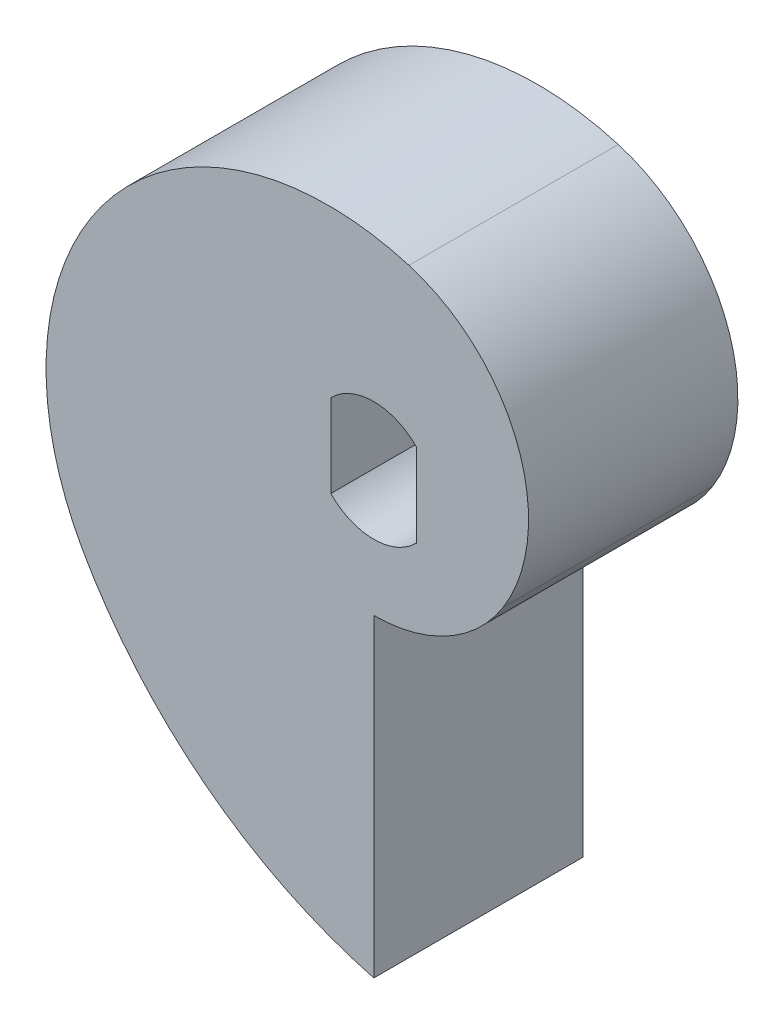
ISO-10303-21;
HEADER;
FILE_DESCRIPTION(('STEP AP214'),'2;1');
FILE_NAME('part.step','',(''),(''),'','','');
FILE_SCHEMA(('AUTOMOTIVE_DESIGN { 1 0 10303 214 1 1 1 1 }'));
ENDSEC;
DATA;
#1=APPLICATION_CONTEXT('core data for automotive mechanical design processes');
#2=APPLICATION_PROTOCOL_DEFINITION('international standard','automotive_design',2000,#1);
#3=PRODUCT_CONTEXT('',#1,'mechanical');
#4=PRODUCT('Part','Part','',(#3));
#5=PRODUCT_RELATED_PRODUCT_CATEGORY('part','',(#4));
#6=PRODUCT_DEFINITION_FORMATION('','',#4);
#7=PRODUCT_DEFINITION_CONTEXT('part definition',#1,'design');
#8=PRODUCT_DEFINITION('design','',#6,#7);
#9=PRODUCT_DEFINITION_SHAPE('','',#8);
#10=(LENGTH_UNIT() NAMED_UNIT(*) SI_UNIT(.MILLI.,.METRE.));
#11=(NAMED_UNIT(*) PLANE_ANGLE_UNIT() SI_UNIT($,.RADIAN.));
#12=(NAMED_UNIT(*) SI_UNIT($,.STERADIAN.) SOLID_ANGLE_UNIT());
#13=UNCERTAINTY_MEASURE_WITH_UNIT(LENGTH_MEASURE(1.E-05),#10,'distance_accuracy_value','');
#14=(GEOMETRIC_REPRESENTATION_CONTEXT(3) GLOBAL_UNCERTAINTY_ASSIGNED_CONTEXT((#13)) GLOBAL_UNIT_ASSIGNED_CONTEXT((#10,
#11,#12)) REPRESENTATION_CONTEXT('',''));
#15=CARTESIAN_POINT('',(0.,0.,0.));
#16=DIRECTION('',(0.,0.,1.));
#17=DIRECTION('',(1.,0.,0.));
#18=AXIS2_PLACEMENT_3D('',#15,#16,#17);
#19=CARTESIAN_POINT('',(-0.598579802256043,1.66233607974994,10.));
#20=DIRECTION('',(0.,0.,-1.));
#21=DIRECTION('',(-1.,0.,0.));
#22=AXIS2_PLACEMENT_3D('',#19,#20,#21);
#23=PLANE('',#22);
#24=CARTESIAN_POINT('',(-0.598579802256043,1.66233607974994,10.));
#25=DIRECTION('',(0.,0.,1.));
#26=DIRECTION('',(-1.,0.,0.));
#27=AXIS2_PLACEMENT_3D('',#24,#25,#26);
#28=CIRCLE('',#27,7.99421046117534);
#29=CARTESIAN_POINT('',(6.18171982166274,-2.57263002489034,10.));
#30=VERTEX_POINT('',#29);
#31=CARTESIAN_POINT('',(1.68133129306247,9.32454243921384,10.));
#32=VERTEX_POINT('',#31);
#33=EDGE_CURVE('E142',#30,#32,#28,.T.);
#34=ORIENTED_EDGE('',*,*,#33,.T.);
#35=CARTESIAN_POINT('',(-2.16584701226822,-3.60485385945115,10.));
#36=DIRECTION('',(0.,0.,1.));
#37=DIRECTION('',(-1.,0.,0.));
#38=AXIS2_PLACEMENT_3D('',#35,#36,#37);
#39=CIRCLE('',#38,13.4896282217465);
#40=CARTESIAN_POINT('',(-13.9291618711325,-10.2074664553985,10.));
#41=VERTEX_POINT('',#40);
#42=EDGE_CURVE('E145',#32,#41,#39,.T.);
#43=ORIENTED_EDGE('',*,*,#42,.T.);
#44=CARTESIAN_POINT('',(5.79406700412999,0.862953827233727,10.));
#45=DIRECTION('',(0.,0.,1.));
#46=DIRECTION('',(-1.,0.,0.));
#47=AXIS2_PLACEMENT_3D('',#44,#45,#46);
#48=CIRCLE('',#47,22.6176913609701);
#49=CARTESIAN_POINT('',(0.,-21.,10.));
#50=VERTEX_POINT('',#49);
#51=EDGE_CURVE('E148',#41,#50,#48,.T.);
#52=ORIENTED_EDGE('',*,*,#51,.T.);
#53=DIRECTION('',(0.,1.,0.));
#54=VECTOR('',#53,1.);
#55=CARTESIAN_POINT('',(0.,-6.,10.));
#56=LINE('',#55,#54);
#57=CARTESIAN_POINT('',(0.,-6.,10.));
#58=VERTEX_POINT('',#57);
#59=EDGE_CURVE('E150',#50,#58,#56,.T.);
#60=ORIENTED_EDGE('',*,*,#59,.T.);
#61=CARTESIAN_POINT('',(0.,1.28846393337251,10.));
#62=DIRECTION('',(0.,0.,1.));
#63=DIRECTION('',(-1.,0.,0.));
#64=AXIS2_PLACEMENT_3D('',#61,#62,#63);
#65=CIRCLE('',#64,7.28846393337251);
#66=EDGE_CURVE('E152',#58,#30,#65,.T.);
#67=ORIENTED_EDGE('',*,*,#66,.T.);
#68=EDGE_LOOP('',(#34,#43,#52,#60,#67));
#69=FACE_BOUND('',#68,.T.);
#70=CARTESIAN_POINT('',(0.,0.,10.));
#71=DIRECTION('',(0.,0.,1.));
#72=DIRECTION('',(1.,0.,0.));
#73=AXIS2_PLACEMENT_3D('',#70,#71,#72);
#74=CIRCLE('',#73,2.85);
#75=CARTESIAN_POINT('',(2.05,1.97989898732233,10.));
#76=VERTEX_POINT('',#75);
#77=CARTESIAN_POINT('',(-2.05,1.97989898732233,10.));
#78=VERTEX_POINT('',#77);
#79=EDGE_CURVE('E106',#76,#78,#74,.T.);
#80=ORIENTED_EDGE('',*,*,#79,.F.);
#81=DIRECTION('',(0.,1.,0.));
#82=VECTOR('',#81,1.);
#83=CARTESIAN_POINT('',(2.05,1.97989898732233,10.));
#84=LINE('',#83,#82);
#85=CARTESIAN_POINT('',(2.05,-1.97989898732233,10.));
#86=VERTEX_POINT('',#85);
#87=EDGE_CURVE('E128',#86,#76,#84,.T.);
#88=ORIENTED_EDGE('',*,*,#87,.F.);
#89=CARTESIAN_POINT('',(0.,0.,10.));
#90=DIRECTION('',(0.,0.,1.));
#91=DIRECTION('',(1.,0.,0.));
#92=AXIS2_PLACEMENT_3D('',#89,#90,#91);
#93=CIRCLE('',#92,2.85);
#94=CARTESIAN_POINT('',(-2.05,-1.97989898732233,10.));
#95=VERTEX_POINT('',#94);
#96=EDGE_CURVE('E126',#95,#86,#93,.T.);
#97=ORIENTED_EDGE('',*,*,#96,.F.);
#98=DIRECTION('',(0.,-1.,0.));
#99=VECTOR('',#98,1.);
#100=CARTESIAN_POINT('',(-2.05,1.97989898732233,10.));
#101=LINE('',#100,#99);
#102=EDGE_CURVE('E114',#78,#95,#101,.T.);
#103=ORIENTED_EDGE('',*,*,#102,.F.);
#104=EDGE_LOOP('',(#80,#88,#97,#103));
#105=FACE_BOUND('',#104,.T.);
#106=ADVANCED_FACE('F35',(#69,#105),#23,.F.);
#107=CARTESIAN_POINT('',(-0.598579802256043,1.66233607974994,0.));
#108=DIRECTION('',(0.,0.,-1.));
#109=DIRECTION('',(-1.,0.,0.));
#110=AXIS2_PLACEMENT_3D('',#107,#108,#109);
#111=PLANE('',#110);
#112=CARTESIAN_POINT('',(-0.598579802256043,1.66233607974994,0.));
#113=DIRECTION('',(0.,0.,1.));
#114=DIRECTION('',(-1.,0.,0.));
#115=AXIS2_PLACEMENT_3D('',#112,#113,#114);
#116=CIRCLE('',#115,7.99421046117534);
#117=CARTESIAN_POINT('',(6.18171982166274,-2.57263002489034,0.));
#118=VERTEX_POINT('',#117);
#119=CARTESIAN_POINT('',(1.68133129306247,9.32454243921384,0.));
#120=VERTEX_POINT('',#119);
#121=EDGE_CURVE('E122',#118,#120,#116,.T.);
#122=ORIENTED_EDGE('',*,*,#121,.F.);
#123=CARTESIAN_POINT('',(0.,1.28846393337251,0.));
#124=DIRECTION('',(0.,0.,1.));
#125=DIRECTION('',(-1.,0.,0.));
#126=AXIS2_PLACEMENT_3D('',#123,#124,#125);
#127=CIRCLE('',#126,7.28846393337251);
#128=CARTESIAN_POINT('',(0.,-6.,0.));
#129=VERTEX_POINT('',#128);
#130=EDGE_CURVE('E146',#129,#118,#127,.T.);
#131=ORIENTED_EDGE('',*,*,#130,.F.);
#132=DIRECTION('',(0.,1.,0.));
#133=VECTOR('',#132,1.);
#134=CARTESIAN_POINT('',(0.,-6.,0.));
#135=LINE('',#134,#133);
#136=CARTESIAN_POINT('',(0.,-21.,0.));
#137=VERTEX_POINT('',#136);
#138=EDGE_CURVE('E161',#137,#129,#135,.T.);
#139=ORIENTED_EDGE('',*,*,#138,.F.);
#140=CARTESIAN_POINT('',(5.79406700412999,0.862953827233727,0.));
#141=DIRECTION('',(0.,0.,1.));
#142=DIRECTION('',(-1.,0.,0.));
#143=AXIS2_PLACEMENT_3D('',#140,#141,#142);
#144=CIRCLE('',#143,22.6176913609701);
#145=CARTESIAN_POINT('',(-13.9291618711325,-10.2074664553985,0.));
#146=VERTEX_POINT('',#145);
#147=EDGE_CURVE('E159',#146,#137,#144,.T.);
#148=ORIENTED_EDGE('',*,*,#147,.F.);
#149=CARTESIAN_POINT('',(-2.16584701226822,-3.60485385945115,0.));
#150=DIRECTION('',(0.,0.,1.));
#151=DIRECTION('',(-1.,0.,0.));
#152=AXIS2_PLACEMENT_3D('',#149,#150,#151);
#153=CIRCLE('',#152,13.4896282217465);
#154=EDGE_CURVE('E157',#120,#146,#153,.T.);
#155=ORIENTED_EDGE('',*,*,#154,.F.);
#156=EDGE_LOOP('',(#122,#131,#139,#148,#155));
#157=FACE_BOUND('',#156,.T.);
#158=DIRECTION('',(0.,1.,0.));
#159=VECTOR('',#158,1.);
#160=CARTESIAN_POINT('',(2.05,1.97989898732233,0.));
#161=LINE('',#160,#159);
#162=CARTESIAN_POINT('',(2.05,-1.97989898732233,0.));
#163=VERTEX_POINT('',#162);
#164=CARTESIAN_POINT('',(2.05,1.97989898732233,0.));
#165=VERTEX_POINT('',#164);
#166=EDGE_CURVE('E115',#163,#165,#161,.T.);
#167=ORIENTED_EDGE('',*,*,#166,.T.);
#168=CARTESIAN_POINT('',(0.,0.,0.));
#169=DIRECTION('',(0.,0.,1.));
#170=DIRECTION('',(1.,0.,0.));
#171=AXIS2_PLACEMENT_3D('',#168,#169,#170);
#172=CIRCLE('',#171,2.85);
#173=CARTESIAN_POINT('',(-2.05,1.97989898732233,0.));
#174=VERTEX_POINT('',#173);
#175=EDGE_CURVE('E58',#165,#174,#172,.T.);
#176=ORIENTED_EDGE('',*,*,#175,.T.);
#177=DIRECTION('',(0.,-1.,0.));
#178=VECTOR('',#177,1.);
#179=CARTESIAN_POINT('',(-2.05,1.97989898732233,0.));
#180=LINE('',#179,#178);
#181=CARTESIAN_POINT('',(-2.05,-1.97989898732233,0.));
#182=VERTEX_POINT('',#181);
#183=EDGE_CURVE('E121',#174,#182,#180,.T.);
#184=ORIENTED_EDGE('',*,*,#183,.T.);
#185=CARTESIAN_POINT('',(0.,0.,0.));
#186=DIRECTION('',(0.,0.,1.));
#187=DIRECTION('',(1.,0.,0.));
#188=AXIS2_PLACEMENT_3D('',#185,#186,#187);
#189=CIRCLE('',#188,2.85);
#190=EDGE_CURVE('E134',#182,#163,#189,.T.);
#191=ORIENTED_EDGE('',*,*,#190,.T.);
#192=EDGE_LOOP('',(#167,#176,#184,#191));
#193=FACE_BOUND('',#192,.T.);
#194=ADVANCED_FACE('F182',(#157,#193),#111,.T.);
#195=CARTESIAN_POINT('',(-0.598579802256043,1.66233607974994,10.));
#196=DIRECTION('',(0.,0.,-1.));
#197=DIRECTION('',(-1.,0.,0.));
#198=AXIS2_PLACEMENT_3D('',#195,#196,#197);
#199=CYLINDRICAL_SURFACE('',#198,7.99421046117534);
#200=ORIENTED_EDGE('',*,*,#121,.T.);
#201=DIRECTION('',(0.,0.,-1.));
#202=VECTOR('',#201,1.);
#203=CARTESIAN_POINT('',(1.68133129306247,9.32454243921384,10.));
#204=LINE('',#203,#202);
#205=EDGE_CURVE('E11',#32,#120,#204,.T.);
#206=ORIENTED_EDGE('',*,*,#205,.F.);
#207=ORIENTED_EDGE('',*,*,#33,.F.);
#208=DIRECTION('',(0.,0.,-1.));
#209=VECTOR('',#208,1.);
#210=CARTESIAN_POINT('',(6.18171982166274,-2.57263002489034,10.));
#211=LINE('',#210,#209);
#212=EDGE_CURVE('E154',#30,#118,#211,.T.);
#213=ORIENTED_EDGE('',*,*,#212,.T.);
#214=EDGE_LOOP('',(#200,#206,#207,#213));
#215=FACE_BOUND('',#214,.T.);
#216=ADVANCED_FACE('F37',(#215),#199,.T.);
#217=CARTESIAN_POINT('',(-2.16584701226822,-3.60485385945115,10.));
#218=DIRECTION('',(0.,0.,-1.));
#219=DIRECTION('',(-1.,0.,0.));
#220=AXIS2_PLACEMENT_3D('',#217,#218,#219);
#221=CYLINDRICAL_SURFACE('',#220,13.4896282217465);
#222=ORIENTED_EDGE('',*,*,#154,.T.);
#223=DIRECTION('',(0.,0.,-1.));
#224=VECTOR('',#223,1.);
#225=CARTESIAN_POINT('',(-13.9291618711325,-10.2074664553985,10.));
#226=LINE('',#225,#224);
#227=EDGE_CURVE('E43',#41,#146,#226,.T.);
#228=ORIENTED_EDGE('',*,*,#227,.F.);
#229=ORIENTED_EDGE('',*,*,#42,.F.);
#230=ORIENTED_EDGE('',*,*,#205,.T.);
#231=EDGE_LOOP('',(#222,#228,#229,#230));
#232=FACE_BOUND('',#231,.T.);
#233=ADVANCED_FACE('F196',(#232),#221,.T.);
#234=CARTESIAN_POINT('',(5.79406700412999,0.862953827233727,10.));
#235=DIRECTION('',(0.,0.,-1.));
#236=DIRECTION('',(-1.,0.,0.));
#237=AXIS2_PLACEMENT_3D('',#234,#235,#236);
#238=CYLINDRICAL_SURFACE('',#237,22.6176913609701);
#239=ORIENTED_EDGE('',*,*,#147,.T.);
#240=DIRECTION('',(0.,0.,-1.));
#241=VECTOR('',#240,1.);
#242=CARTESIAN_POINT('',(0.,-21.,10.));
#243=LINE('',#242,#241);
#244=EDGE_CURVE('E169',#50,#137,#243,.T.);
#245=ORIENTED_EDGE('',*,*,#244,.F.);
#246=ORIENTED_EDGE('',*,*,#51,.F.);
#247=ORIENTED_EDGE('',*,*,#227,.T.);
#248=EDGE_LOOP('',(#239,#245,#246,#247));
#249=FACE_BOUND('',#248,.T.);
#250=ADVANCED_FACE('F176',(#249),#238,.T.);
#251=CARTESIAN_POINT('',(0.,-6.,10.));
#252=DIRECTION('',(-1.,0.,0.));
#253=DIRECTION('',(0.,0.,1.));
#254=AXIS2_PLACEMENT_3D('',#251,#252,#253);
#255=PLANE('',#254);
#256=ORIENTED_EDGE('',*,*,#138,.T.);
#257=DIRECTION('',(0.,0.,-1.));
#258=VECTOR('',#257,1.);
#259=CARTESIAN_POINT('',(0.,-6.,10.));
#260=LINE('',#259,#258);
#261=EDGE_CURVE('E166',#58,#129,#260,.T.);
#262=ORIENTED_EDGE('',*,*,#261,.F.);
#263=ORIENTED_EDGE('',*,*,#59,.F.);
#264=ORIENTED_EDGE('',*,*,#244,.T.);
#265=EDGE_LOOP('',(#256,#262,#263,#264));
#266=FACE_BOUND('',#265,.T.);
#267=ADVANCED_FACE('F187',(#266),#255,.F.);
#268=CARTESIAN_POINT('',(0.,1.28846393337251,10.));
#269=DIRECTION('',(0.,0.,-1.));
#270=DIRECTION('',(-1.,0.,0.));
#271=AXIS2_PLACEMENT_3D('',#268,#269,#270);
#272=CYLINDRICAL_SURFACE('',#271,7.28846393337251);
#273=ORIENTED_EDGE('',*,*,#130,.T.);
#274=ORIENTED_EDGE('',*,*,#212,.F.);
#275=ORIENTED_EDGE('',*,*,#66,.F.);
#276=ORIENTED_EDGE('',*,*,#261,.T.);
#277=EDGE_LOOP('',(#273,#274,#275,#276));
#278=FACE_BOUND('',#277,.T.);
#279=ADVANCED_FACE('F191',(#278),#272,.T.);
#280=CARTESIAN_POINT('',(0.,0.,10.));
#281=DIRECTION('',(0.,0.,-1.));
#282=DIRECTION('',(-1.,0.,0.));
#283=AXIS2_PLACEMENT_3D('',#280,#281,#282);
#284=CYLINDRICAL_SURFACE('',#283,2.85);
#285=ORIENTED_EDGE('',*,*,#175,.F.);
#286=DIRECTION('',(0.,0.,-1.));
#287=VECTOR('',#286,1.);
#288=CARTESIAN_POINT('',(2.05,1.97989898732233,10.));
#289=LINE('',#288,#287);
#290=EDGE_CURVE('E110',#76,#165,#289,.T.);
#291=ORIENTED_EDGE('',*,*,#290,.F.);
#292=ORIENTED_EDGE('',*,*,#79,.T.);
#293=DIRECTION('',(0.,0.,-1.));
#294=VECTOR('',#293,1.);
#295=CARTESIAN_POINT('',(-2.05,1.97989898732233,10.));
#296=LINE('',#295,#294);
#297=EDGE_CURVE('E109',#78,#174,#296,.T.);
#298=ORIENTED_EDGE('',*,*,#297,.T.);
#299=EDGE_LOOP('',(#285,#291,#292,#298));
#300=FACE_BOUND('',#299,.T.);
#301=ADVANCED_FACE('F108',(#300),#284,.F.);
#302=CARTESIAN_POINT('',(-2.05,1.97989898732233,10.));
#303=DIRECTION('',(1.,0.,0.));
#304=DIRECTION('',(0.,0.,-1.));
#305=AXIS2_PLACEMENT_3D('',#302,#303,#304);
#306=PLANE('',#305);
#307=ORIENTED_EDGE('',*,*,#183,.F.);
#308=ORIENTED_EDGE('',*,*,#297,.F.);
#309=ORIENTED_EDGE('',*,*,#102,.T.);
#310=DIRECTION('',(0.,0.,-1.));
#311=VECTOR('',#310,1.);
#312=CARTESIAN_POINT('',(-2.05,-1.97989898732233,10.));
#313=LINE('',#312,#311);
#314=EDGE_CURVE('E123',#95,#182,#313,.T.);
#315=ORIENTED_EDGE('',*,*,#314,.T.);
#316=EDGE_LOOP('',(#307,#308,#309,#315));
#317=FACE_BOUND('',#316,.T.);
#318=ADVANCED_FACE('F118',(#317),#306,.T.);
#319=CARTESIAN_POINT('',(0.,0.,10.));
#320=DIRECTION('',(0.,0.,-1.));
#321=DIRECTION('',(-1.,0.,0.));
#322=AXIS2_PLACEMENT_3D('',#319,#320,#321);
#323=CYLINDRICAL_SURFACE('',#322,2.85);
#324=ORIENTED_EDGE('',*,*,#190,.F.);
#325=ORIENTED_EDGE('',*,*,#314,.F.);
#326=ORIENTED_EDGE('',*,*,#96,.T.);
#327=DIRECTION('',(0.,0.,-1.));
#328=VECTOR('',#327,1.);
#329=CARTESIAN_POINT('',(2.05,-1.97989898732233,10.));
#330=LINE('',#329,#328);
#331=EDGE_CURVE('E50',#86,#163,#330,.T.);
#332=ORIENTED_EDGE('',*,*,#331,.T.);
#333=EDGE_LOOP('',(#324,#325,#326,#332));
#334=FACE_BOUND('',#333,.T.);
#335=ADVANCED_FACE('F239',(#334),#323,.F.);
#336=CARTESIAN_POINT('',(2.05,1.97989898732233,10.));
#337=DIRECTION('',(-1.,0.,0.));
#338=DIRECTION('',(0.,0.,1.));
#339=AXIS2_PLACEMENT_3D('',#336,#337,#338);
#340=PLANE('',#339);
#341=ORIENTED_EDGE('',*,*,#166,.F.);
#342=ORIENTED_EDGE('',*,*,#331,.F.);
#343=ORIENTED_EDGE('',*,*,#87,.T.);
#344=ORIENTED_EDGE('',*,*,#290,.T.);
#345=EDGE_LOOP('',(#341,#342,#343,#344));
#346=FACE_BOUND('',#345,.T.);
#347=ADVANCED_FACE('F245',(#346),#340,.T.);
#348=CLOSED_SHELL('',(#106,#194,#216,#233,#250,#267,#279,#301,#318,#335,#347));
#349=MANIFOLD_SOLID_BREP('B2',#348);
#350=ADVANCED_BREP_SHAPE_REPRESENTATION('',(#18,#349),#14);
#351=SHAPE_DEFINITION_REPRESENTATION(#9,#350);
ENDSEC;
END-ISO-10303-21;
